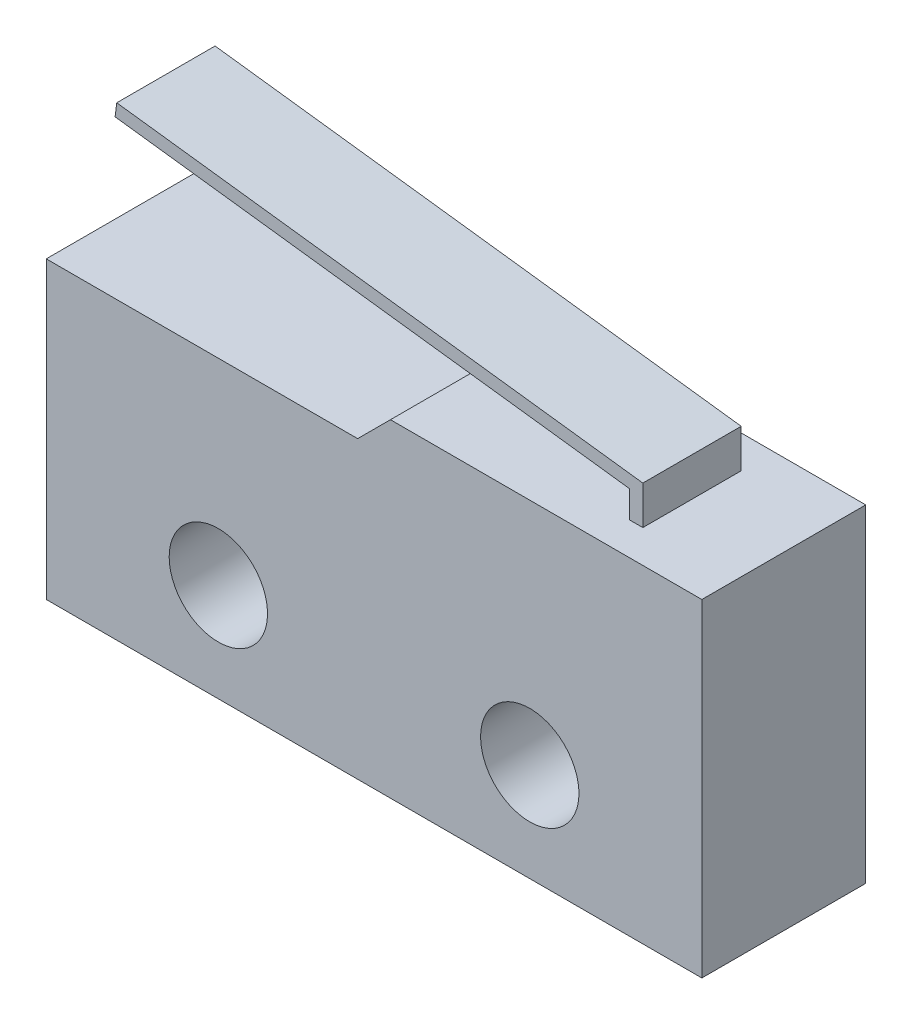
ISO-10303-21;
HEADER;
FILE_DESCRIPTION(('STEP AP214'),'2;1');
FILE_NAME('part.step','',(''),(''),'','','');
FILE_SCHEMA(('AUTOMOTIVE_DESIGN { 1 0 10303 214 1 1 1 1 }'));
ENDSEC;
DATA;
#1=APPLICATION_CONTEXT('core data for automotive mechanical design processes');
#2=APPLICATION_PROTOCOL_DEFINITION('international standard','automotive_design',2000,#1);
#3=PRODUCT_CONTEXT('',#1,'mechanical');
#4=PRODUCT('Part','Part','',(#3));
#5=PRODUCT_RELATED_PRODUCT_CATEGORY('part','',(#4));
#6=PRODUCT_DEFINITION_FORMATION('','',#4);
#7=PRODUCT_DEFINITION_CONTEXT('part definition',#1,'design');
#8=PRODUCT_DEFINITION('design','',#6,#7);
#9=PRODUCT_DEFINITION_SHAPE('','',#8);
#10=(LENGTH_UNIT() NAMED_UNIT(*) SI_UNIT(.MILLI.,.METRE.));
#11=(NAMED_UNIT(*) PLANE_ANGLE_UNIT() SI_UNIT($,.RADIAN.));
#12=(NAMED_UNIT(*) SI_UNIT($,.STERADIAN.) SOLID_ANGLE_UNIT());
#13=UNCERTAINTY_MEASURE_WITH_UNIT(LENGTH_MEASURE(1.E-05),#10,'distance_accuracy_value','');
#14=(GEOMETRIC_REPRESENTATION_CONTEXT(3) GLOBAL_UNCERTAINTY_ASSIGNED_CONTEXT((#13)) GLOBAL_UNIT_ASSIGNED_CONTEXT((#10,
#11,#12)) REPRESENTATION_CONTEXT('',''));
#15=CARTESIAN_POINT('',(0.,0.,0.));
#16=DIRECTION('',(0.,0.,1.));
#17=DIRECTION('',(1.,0.,0.));
#18=AXIS2_PLACEMENT_3D('',#15,#16,#17);
#19=CARTESIAN_POINT('',(10.,-5.,2.5));
#20=DIRECTION('',(-1.,0.,0.));
#21=DIRECTION('',(0.,0.,1.));
#22=AXIS2_PLACEMENT_3D('',#19,#20,#21);
#23=PLANE('',#22);
#24=DIRECTION('',(0.,1.,0.));
#25=VECTOR('',#24,1.);
#26=CARTESIAN_POINT('',(10.,-5.,-2.5));
#27=LINE('',#26,#25);
#28=CARTESIAN_POINT('',(10.,-5.,-2.5));
#29=VERTEX_POINT('',#28);
#30=CARTESIAN_POINT('',(10.,5.,-2.5));
#31=VERTEX_POINT('',#30);
#32=EDGE_CURVE('E181',#29,#31,#27,.T.);
#33=ORIENTED_EDGE('',*,*,#32,.T.);
#34=DIRECTION('',(0.,0.,-1.));
#35=VECTOR('',#34,1.);
#36=CARTESIAN_POINT('',(10.,5.,2.5));
#37=LINE('',#36,#35);
#38=CARTESIAN_POINT('',(10.,5.,2.5));
#39=VERTEX_POINT('',#38);
#40=EDGE_CURVE('E11',#39,#31,#37,.T.);
#41=ORIENTED_EDGE('',*,*,#40,.F.);
#42=DIRECTION('',(0.,1.,0.));
#43=VECTOR('',#42,1.);
#44=CARTESIAN_POINT('',(10.,-5.,2.5));
#45=LINE('',#44,#43);
#46=CARTESIAN_POINT('',(10.,-5.,2.5));
#47=VERTEX_POINT('',#46);
#48=EDGE_CURVE('E182',#47,#39,#45,.T.);
#49=ORIENTED_EDGE('',*,*,#48,.F.);
#50=DIRECTION('',(0.,0.,-1.));
#51=VECTOR('',#50,1.);
#52=CARTESIAN_POINT('',(10.,-5.,2.5));
#53=LINE('',#52,#51);
#54=EDGE_CURVE('E196',#47,#29,#53,.T.);
#55=ORIENTED_EDGE('',*,*,#54,.T.);
#56=EDGE_LOOP('',(#33,#41,#49,#55));
#57=FACE_BOUND('',#56,.T.);
#58=ADVANCED_FACE('F33',(#57),#23,.F.);
#59=CARTESIAN_POINT('',(0.5,5.,2.5));
#60=DIRECTION('',(0.,-1.,0.));
#61=DIRECTION('',(0.,0.,-1.));
#62=AXIS2_PLACEMENT_3D('',#59,#60,#61);
#63=PLANE('',#62);
#64=DIRECTION('',(0.,0.,-1.));
#65=VECTOR('',#64,1.);
#66=CARTESIAN_POINT('',(7.2,5.,1.5));
#67=LINE('',#66,#65);
#68=CARTESIAN_POINT('',(7.2,5.,1.5));
#69=VERTEX_POINT('',#68);
#70=CARTESIAN_POINT('',(7.2,5.,-1.5));
#71=VERTEX_POINT('',#70);
#72=EDGE_CURVE('E47',#69,#71,#67,.T.);
#73=ORIENTED_EDGE('',*,*,#72,.F.);
#74=DIRECTION('',(1.,0.,0.));
#75=VECTOR('',#74,1.);
#76=CARTESIAN_POINT('',(6.8,5.,1.5));
#77=LINE('',#76,#75);
#78=CARTESIAN_POINT('',(6.8,5.,1.5));
#79=VERTEX_POINT('',#78);
#80=EDGE_CURVE('E52',#79,#69,#77,.T.);
#81=ORIENTED_EDGE('',*,*,#80,.F.);
#82=DIRECTION('',(0.,0.,-1.));
#83=VECTOR('',#82,1.);
#84=CARTESIAN_POINT('',(6.8,5.,1.5));
#85=LINE('',#84,#83);
#86=CARTESIAN_POINT('',(6.8,5.,-1.5));
#87=VERTEX_POINT('',#86);
#88=EDGE_CURVE('E147',#79,#87,#85,.T.);
#89=ORIENTED_EDGE('',*,*,#88,.T.);
#90=DIRECTION('',(1.,0.,0.));
#91=VECTOR('',#90,1.);
#92=CARTESIAN_POINT('',(6.8,5.,-1.5));
#93=LINE('',#92,#91);
#94=EDGE_CURVE('E148',#87,#71,#93,.T.);
#95=ORIENTED_EDGE('',*,*,#94,.T.);
#96=EDGE_LOOP('',(#73,#81,#89,#95));
#97=FACE_BOUND('',#96,.T.);
#98=DIRECTION('',(-1.,0.,0.));
#99=VECTOR('',#98,1.);
#100=CARTESIAN_POINT('',(0.5,5.,-2.5));
#101=LINE('',#100,#99);
#102=CARTESIAN_POINT('',(0.5,5.,-2.5));
#103=VERTEX_POINT('',#102);
#104=EDGE_CURVE('E199',#31,#103,#101,.T.);
#105=ORIENTED_EDGE('',*,*,#104,.T.);
#106=DIRECTION('',(0.,0.,-1.));
#107=VECTOR('',#106,1.);
#108=CARTESIAN_POINT('',(0.5,5.,2.5));
#109=LINE('',#108,#107);
#110=CARTESIAN_POINT('',(0.5,5.,2.5));
#111=VERTEX_POINT('',#110);
#112=EDGE_CURVE('E40',#111,#103,#109,.T.);
#113=ORIENTED_EDGE('',*,*,#112,.F.);
#114=DIRECTION('',(-1.,0.,0.));
#115=VECTOR('',#114,1.);
#116=CARTESIAN_POINT('',(0.5,5.,2.5));
#117=LINE('',#116,#115);
#118=EDGE_CURVE('E185',#39,#111,#117,.T.);
#119=ORIENTED_EDGE('',*,*,#118,.F.);
#120=ORIENTED_EDGE('',*,*,#40,.T.);
#121=EDGE_LOOP('',(#105,#113,#119,#120));
#122=FACE_BOUND('',#121,.T.);
#123=ADVANCED_FACE('F246',(#97,#122),#63,.F.);
#124=CARTESIAN_POINT('',(-0.5,4.,2.5));
#125=DIRECTION('',(0.707106781186548,-0.707106781186548,0.));
#126=DIRECTION('',(0.707106781186548,0.707106781186548,0.));
#127=AXIS2_PLACEMENT_3D('',#124,#125,#126);
#128=PLANE('',#127);
#129=DIRECTION('',(-0.707106781186548,-0.707106781186548,0.));
#130=VECTOR('',#129,1.);
#131=CARTESIAN_POINT('',(-0.5,4.,-2.5));
#132=LINE('',#131,#130);
#133=CARTESIAN_POINT('',(-0.5,4.,-2.5));
#134=VERTEX_POINT('',#133);
#135=EDGE_CURVE('E201',#103,#134,#132,.T.);
#136=ORIENTED_EDGE('',*,*,#135,.T.);
#137=DIRECTION('',(0.,0.,-1.));
#138=VECTOR('',#137,1.);
#139=CARTESIAN_POINT('',(-0.5,4.,2.5));
#140=LINE('',#139,#138);
#141=CARTESIAN_POINT('',(-0.5,4.,2.5));
#142=VERTEX_POINT('',#141);
#143=EDGE_CURVE('E216',#142,#134,#140,.T.);
#144=ORIENTED_EDGE('',*,*,#143,.F.);
#145=DIRECTION('',(-0.707106781186548,-0.707106781186548,0.));
#146=VECTOR('',#145,1.);
#147=CARTESIAN_POINT('',(-0.5,4.,2.5));
#148=LINE('',#147,#146);
#149=EDGE_CURVE('E188',#111,#142,#148,.T.);
#150=ORIENTED_EDGE('',*,*,#149,.F.);
#151=ORIENTED_EDGE('',*,*,#112,.T.);
#152=EDGE_LOOP('',(#136,#144,#150,#151));
#153=FACE_BOUND('',#152,.T.);
#154=ADVANCED_FACE('F223',(#153),#128,.F.);
#155=CARTESIAN_POINT('',(-10.,4.,2.5));
#156=DIRECTION('',(0.,-1.,0.));
#157=DIRECTION('',(0.,0.,-1.));
#158=AXIS2_PLACEMENT_3D('',#155,#156,#157);
#159=PLANE('',#158);
#160=DIRECTION('',(-1.,0.,0.));
#161=VECTOR('',#160,1.);
#162=CARTESIAN_POINT('',(-10.,4.,-2.5));
#163=LINE('',#162,#161);
#164=CARTESIAN_POINT('',(-10.,4.,-2.5));
#165=VERTEX_POINT('',#164);
#166=EDGE_CURVE('E203',#134,#165,#163,.T.);
#167=ORIENTED_EDGE('',*,*,#166,.T.);
#168=DIRECTION('',(0.,0.,-1.));
#169=VECTOR('',#168,1.);
#170=CARTESIAN_POINT('',(-10.,4.,2.5));
#171=LINE('',#170,#169);
#172=CARTESIAN_POINT('',(-10.,4.,2.5));
#173=VERTEX_POINT('',#172);
#174=EDGE_CURVE('E213',#173,#165,#171,.T.);
#175=ORIENTED_EDGE('',*,*,#174,.F.);
#176=DIRECTION('',(-1.,0.,0.));
#177=VECTOR('',#176,1.);
#178=CARTESIAN_POINT('',(-10.,4.,2.5));
#179=LINE('',#178,#177);
#180=EDGE_CURVE('E190',#142,#173,#179,.T.);
#181=ORIENTED_EDGE('',*,*,#180,.F.);
#182=ORIENTED_EDGE('',*,*,#143,.T.);
#183=EDGE_LOOP('',(#167,#175,#181,#182));
#184=FACE_BOUND('',#183,.T.);
#185=ADVANCED_FACE('F234',(#184),#159,.F.);
#186=CARTESIAN_POINT('',(-10.,-5.,2.5));
#187=DIRECTION('',(1.,0.,0.));
#188=DIRECTION('',(0.,0.,-1.));
#189=AXIS2_PLACEMENT_3D('',#186,#187,#188);
#190=PLANE('',#189);
#191=DIRECTION('',(0.,-1.,0.));
#192=VECTOR('',#191,1.);
#193=CARTESIAN_POINT('',(-10.,-5.,-2.5));
#194=LINE('',#193,#192);
#195=CARTESIAN_POINT('',(-10.,-5.,-2.5));
#196=VERTEX_POINT('',#195);
#197=EDGE_CURVE('E205',#165,#196,#194,.T.);
#198=ORIENTED_EDGE('',*,*,#197,.T.);
#199=DIRECTION('',(0.,0.,-1.));
#200=VECTOR('',#199,1.);
#201=CARTESIAN_POINT('',(-10.,-5.,2.5));
#202=LINE('',#201,#200);
#203=CARTESIAN_POINT('',(-10.,-5.,2.5));
#204=VERTEX_POINT('',#203);
#205=EDGE_CURVE('E210',#204,#196,#202,.T.);
#206=ORIENTED_EDGE('',*,*,#205,.F.);
#207=DIRECTION('',(0.,-1.,0.));
#208=VECTOR('',#207,1.);
#209=CARTESIAN_POINT('',(-10.,-5.,2.5));
#210=LINE('',#209,#208);
#211=EDGE_CURVE('E192',#173,#204,#210,.T.);
#212=ORIENTED_EDGE('',*,*,#211,.F.);
#213=ORIENTED_EDGE('',*,*,#174,.T.);
#214=EDGE_LOOP('',(#198,#206,#212,#213));
#215=FACE_BOUND('',#214,.T.);
#216=ADVANCED_FACE('F238',(#215),#190,.F.);
#217=CARTESIAN_POINT('',(-10.,-5.,2.5));
#218=DIRECTION('',(0.,1.,0.));
#219=DIRECTION('',(0.,0.,1.));
#220=AXIS2_PLACEMENT_3D('',#217,#218,#219);
#221=PLANE('',#220);
#222=DIRECTION('',(1.,0.,0.));
#223=VECTOR('',#222,1.);
#224=CARTESIAN_POINT('',(-10.,-5.,-2.5));
#225=LINE('',#224,#223);
#226=EDGE_CURVE('E186',#196,#29,#225,.T.);
#227=ORIENTED_EDGE('',*,*,#226,.T.);
#228=ORIENTED_EDGE('',*,*,#54,.F.);
#229=DIRECTION('',(1.,0.,0.));
#230=VECTOR('',#229,1.);
#231=CARTESIAN_POINT('',(-10.,-5.,2.5));
#232=LINE('',#231,#230);
#233=EDGE_CURVE('E194',#204,#47,#232,.T.);
#234=ORIENTED_EDGE('',*,*,#233,.F.);
#235=ORIENTED_EDGE('',*,*,#205,.T.);
#236=EDGE_LOOP('',(#227,#228,#234,#235));
#237=FACE_BOUND('',#236,.T.);
#238=ADVANCED_FACE('F249',(#237),#221,.F.);
#239=CARTESIAN_POINT('',(10.,5.,2.5));
#240=DIRECTION('',(0.,0.,-1.));
#241=DIRECTION('',(-1.,0.,0.));
#242=AXIS2_PLACEMENT_3D('',#239,#240,#241);
#243=PLANE('',#242);
#244=CARTESIAN_POINT('',(4.75,-2.,2.5));
#245=DIRECTION('',(0.,0.,-1.));
#246=DIRECTION('',(-1.,0.,0.));
#247=AXIS2_PLACEMENT_3D('',#244,#245,#246);
#248=CIRCLE('',#247,1.49999999999999);
#249=CARTESIAN_POINT('',(3.25000000000001,-2.,2.5));
#250=VERTEX_POINT('',#249);
#251=EDGE_CURVE('E172',#250,#250,#248,.T.);
#252=ORIENTED_EDGE('',*,*,#251,.T.);
#253=EDGE_LOOP('',(#252));
#254=FACE_BOUND('',#253,.T.);
#255=CARTESIAN_POINT('',(-4.75,-2.,2.5));
#256=DIRECTION('',(0.,0.,-1.));
#257=DIRECTION('',(-1.,0.,0.));
#258=AXIS2_PLACEMENT_3D('',#255,#256,#257);
#259=CIRCLE('',#258,1.49999999999999);
#260=CARTESIAN_POINT('',(-6.24999999999999,-2.,2.5));
#261=VERTEX_POINT('',#260);
#262=EDGE_CURVE('E178',#261,#261,#259,.T.);
#263=ORIENTED_EDGE('',*,*,#262,.T.);
#264=EDGE_LOOP('',(#263));
#265=FACE_BOUND('',#264,.T.);
#266=ORIENTED_EDGE('',*,*,#48,.T.);
#267=ORIENTED_EDGE('',*,*,#118,.T.);
#268=ORIENTED_EDGE('',*,*,#149,.T.);
#269=ORIENTED_EDGE('',*,*,#180,.T.);
#270=ORIENTED_EDGE('',*,*,#211,.T.);
#271=ORIENTED_EDGE('',*,*,#233,.T.);
#272=EDGE_LOOP('',(#266,#267,#268,#269,#270,#271));
#273=FACE_BOUND('',#272,.T.);
#274=ADVANCED_FACE('F242',(#254,#265,#273),#243,.F.);
#275=CARTESIAN_POINT('',(10.,5.,-2.5));
#276=DIRECTION('',(0.,0.,-1.));
#277=DIRECTION('',(-1.,0.,0.));
#278=AXIS2_PLACEMENT_3D('',#275,#276,#277);
#279=PLANE('',#278);
#280=CARTESIAN_POINT('',(4.75,-2.,-2.5));
#281=DIRECTION('',(0.,0.,-1.));
#282=DIRECTION('',(-1.,0.,0.));
#283=AXIS2_PLACEMENT_3D('',#280,#281,#282);
#284=CIRCLE('',#283,1.49999999999999);
#285=CARTESIAN_POINT('',(3.25000000000001,-2.,-2.5));
#286=VERTEX_POINT('',#285);
#287=EDGE_CURVE('E169',#286,#286,#284,.T.);
#288=ORIENTED_EDGE('',*,*,#287,.F.);
#289=EDGE_LOOP('',(#288));
#290=FACE_BOUND('',#289,.T.);
#291=CARTESIAN_POINT('',(-4.75,-2.,-2.5));
#292=DIRECTION('',(0.,0.,-1.));
#293=DIRECTION('',(-1.,0.,0.));
#294=AXIS2_PLACEMENT_3D('',#291,#292,#293);
#295=CIRCLE('',#294,1.49999999999999);
#296=CARTESIAN_POINT('',(-6.24999999999999,-2.,-2.5));
#297=VERTEX_POINT('',#296);
#298=EDGE_CURVE('E175',#297,#297,#295,.T.);
#299=ORIENTED_EDGE('',*,*,#298,.F.);
#300=EDGE_LOOP('',(#299));
#301=FACE_BOUND('',#300,.T.);
#302=ORIENTED_EDGE('',*,*,#32,.F.);
#303=ORIENTED_EDGE('',*,*,#226,.F.);
#304=ORIENTED_EDGE('',*,*,#197,.F.);
#305=ORIENTED_EDGE('',*,*,#166,.F.);
#306=ORIENTED_EDGE('',*,*,#135,.F.);
#307=ORIENTED_EDGE('',*,*,#104,.F.);
#308=EDGE_LOOP('',(#302,#303,#304,#305,#306,#307));
#309=FACE_BOUND('',#308,.T.);
#310=ADVANCED_FACE('F229',(#290,#301,#309),#279,.T.);
#311=CARTESIAN_POINT('',(-4.75,-2.,-2.5));
#312=DIRECTION('',(0.,0.,-1.));
#313=DIRECTION('',(-1.,0.,0.));
#314=AXIS2_PLACEMENT_3D('',#311,#312,#313);
#315=CYLINDRICAL_SURFACE('',#314,1.49999999999999);
#316=ORIENTED_EDGE('',*,*,#262,.F.);
#317=EDGE_LOOP('',(#316));
#318=FACE_BOUND('',#317,.T.);
#319=ORIENTED_EDGE('',*,*,#298,.T.);
#320=EDGE_LOOP('',(#319));
#321=FACE_BOUND('',#320,.T.);
#322=ADVANCED_FACE('F297',(#318,#321),#315,.F.);
#323=CARTESIAN_POINT('',(4.75,-2.,-2.5));
#324=DIRECTION('',(0.,0.,-1.));
#325=DIRECTION('',(-1.,0.,0.));
#326=AXIS2_PLACEMENT_3D('',#323,#324,#325);
#327=CYLINDRICAL_SURFACE('',#326,1.49999999999999);
#328=ORIENTED_EDGE('',*,*,#251,.F.);
#329=EDGE_LOOP('',(#328));
#330=FACE_BOUND('',#329,.T.);
#331=ORIENTED_EDGE('',*,*,#287,.T.);
#332=EDGE_LOOP('',(#331));
#333=FACE_BOUND('',#332,.T.);
#334=ADVANCED_FACE('F306',(#330,#333),#327,.F.);
#335=CARTESIAN_POINT('',(7.2,5.,1.5));
#336=DIRECTION('',(-1.,0.,0.));
#337=DIRECTION('',(0.,0.,1.));
#338=AXIS2_PLACEMENT_3D('',#335,#336,#337);
#339=PLANE('',#338);
#340=DIRECTION('',(0.,1.,0.));
#341=VECTOR('',#340,1.);
#342=CARTESIAN_POINT('',(7.2,5.,-1.5));
#343=LINE('',#342,#341);
#344=CARTESIAN_POINT('',(7.2,6.17638342073764,-1.5));
#345=VERTEX_POINT('',#344);
#346=EDGE_CURVE('E130',#71,#345,#343,.T.);
#347=ORIENTED_EDGE('',*,*,#346,.T.);
#348=DIRECTION('',(0.,0.,-1.));
#349=VECTOR('',#348,1.);
#350=CARTESIAN_POINT('',(7.2,6.17638342073764,1.5));
#351=LINE('',#350,#349);
#352=CARTESIAN_POINT('',(7.2,6.17638342073764,1.5));
#353=VERTEX_POINT('',#352);
#354=EDGE_CURVE('E127',#353,#345,#351,.T.);
#355=ORIENTED_EDGE('',*,*,#354,.F.);
#356=DIRECTION('',(0.,1.,0.));
#357=VECTOR('',#356,1.);
#358=CARTESIAN_POINT('',(7.2,5.,1.5));
#359=LINE('',#358,#357);
#360=EDGE_CURVE('E118',#69,#353,#359,.T.);
#361=ORIENTED_EDGE('',*,*,#360,.F.);
#362=ORIENTED_EDGE('',*,*,#72,.T.);
#363=EDGE_LOOP('',(#347,#355,#361,#362));
#364=FACE_BOUND('',#363,.T.);
#365=ADVANCED_FACE('F128',(#364),#339,.F.);
#366=CARTESIAN_POINT('',(7.2,6.17638342073764,1.5));
#367=DIRECTION('',(-0.125,-0.992156741649221,0.));
#368=DIRECTION('',(0.992156741649222,-0.125,0.));
#369=AXIS2_PLACEMENT_3D('',#366,#367,#368);
#370=PLANE('',#369);
#371=DIRECTION('',(-0.992156741649221,0.125,0.));
#372=VECTOR('',#371,1.);
#373=CARTESIAN_POINT('',(7.2,6.17638342073764,-1.5));
#374=LINE('',#373,#372);
#375=CARTESIAN_POINT('',(-8.84950786638754,8.19843134832984,-1.5));
#376=VERTEX_POINT('',#375);
#377=EDGE_CURVE('E151',#345,#376,#374,.T.);
#378=ORIENTED_EDGE('',*,*,#377,.T.);
#379=DIRECTION('',(0.,0.,-1.));
#380=VECTOR('',#379,1.);
#381=CARTESIAN_POINT('',(-8.84950786638754,8.19843134832984,1.5));
#382=LINE('',#381,#380);
#383=CARTESIAN_POINT('',(-8.84950786638754,8.19843134832984,1.5));
#384=VERTEX_POINT('',#383);
#385=EDGE_CURVE('E133',#384,#376,#382,.T.);
#386=ORIENTED_EDGE('',*,*,#385,.F.);
#387=DIRECTION('',(-0.992156741649221,0.125,0.));
#388=VECTOR('',#387,1.);
#389=CARTESIAN_POINT('',(7.2,6.17638342073764,1.5));
#390=LINE('',#389,#388);
#391=EDGE_CURVE('E122',#353,#384,#390,.T.);
#392=ORIENTED_EDGE('',*,*,#391,.F.);
#393=ORIENTED_EDGE('',*,*,#354,.T.);
#394=EDGE_LOOP('',(#378,#386,#392,#393));
#395=FACE_BOUND('',#394,.T.);
#396=ADVANCED_FACE('F135',(#395),#370,.F.);
#397=CARTESIAN_POINT('',(-8.84950786638754,8.19843134832984,1.5));
#398=DIRECTION('',(0.992156741649221,-0.125000000000003,0.));
#399=DIRECTION('',(0.125000000000004,0.992156741649221,0.));
#400=AXIS2_PLACEMENT_3D('',#397,#398,#399);
#401=PLANE('',#400);
#402=DIRECTION('',(-0.125000000000003,-0.992156741649221,0.));
#403=VECTOR('',#402,1.);
#404=CARTESIAN_POINT('',(-8.84950786638754,8.19843134832984,-1.5));
#405=LINE('',#404,#403);
#406=CARTESIAN_POINT('',(-8.89950786638754,7.80156865167016,-1.5));
#407=VERTEX_POINT('',#406);
#408=EDGE_CURVE('E153',#376,#407,#405,.T.);
#409=ORIENTED_EDGE('',*,*,#408,.T.);
#410=DIRECTION('',(0.,0.,-1.));
#411=VECTOR('',#410,1.);
#412=CARTESIAN_POINT('',(-8.89950786638754,7.80156865167016,1.5));
#413=LINE('',#412,#411);
#414=CARTESIAN_POINT('',(-8.89950786638754,7.80156865167016,1.5));
#415=VERTEX_POINT('',#414);
#416=EDGE_CURVE('E164',#415,#407,#413,.T.);
#417=ORIENTED_EDGE('',*,*,#416,.F.);
#418=DIRECTION('',(-0.125000000000003,-0.992156741649221,0.));
#419=VECTOR('',#418,1.);
#420=CARTESIAN_POINT('',(-8.84950786638754,8.19843134832984,1.5));
#421=LINE('',#420,#419);
#422=EDGE_CURVE('E138',#384,#415,#421,.T.);
#423=ORIENTED_EDGE('',*,*,#422,.F.);
#424=ORIENTED_EDGE('',*,*,#385,.T.);
#425=EDGE_LOOP('',(#409,#417,#423,#424));
#426=FACE_BOUND('',#425,.T.);
#427=ADVANCED_FACE('F339',(#426),#401,.F.);
#428=CARTESIAN_POINT('',(6.8,5.82361657926236,1.5));
#429=DIRECTION('',(0.125,0.992156741649221,0.));
#430=DIRECTION('',(-0.992156741649222,0.125,0.));
#431=AXIS2_PLACEMENT_3D('',#428,#429,#430);
#432=PLANE('',#431);
#433=DIRECTION('',(0.992156741649222,-0.125,0.));
#434=VECTOR('',#433,1.);
#435=CARTESIAN_POINT('',(6.8,5.82361657926236,-1.5));
#436=LINE('',#435,#434);
#437=CARTESIAN_POINT('',(6.8,5.82361657926236,-1.5));
#438=VERTEX_POINT('',#437);
#439=EDGE_CURVE('E155',#407,#438,#436,.T.);
#440=ORIENTED_EDGE('',*,*,#439,.T.);
#441=DIRECTION('',(0.,0.,-1.));
#442=VECTOR('',#441,1.);
#443=CARTESIAN_POINT('',(6.8,5.82361657926236,1.5));
#444=LINE('',#443,#442);
#445=CARTESIAN_POINT('',(6.8,5.82361657926236,1.5));
#446=VERTEX_POINT('',#445);
#447=EDGE_CURVE('E161',#446,#438,#444,.T.);
#448=ORIENTED_EDGE('',*,*,#447,.F.);
#449=DIRECTION('',(0.992156741649222,-0.125,0.));
#450=VECTOR('',#449,1.);
#451=CARTESIAN_POINT('',(6.8,5.82361657926236,1.5));
#452=LINE('',#451,#450);
#453=EDGE_CURVE('E140',#415,#446,#452,.T.);
#454=ORIENTED_EDGE('',*,*,#453,.F.);
#455=ORIENTED_EDGE('',*,*,#416,.T.);
#456=EDGE_LOOP('',(#440,#448,#454,#455));
#457=FACE_BOUND('',#456,.T.);
#458=ADVANCED_FACE('F348',(#457),#432,.F.);
#459=CARTESIAN_POINT('',(6.8,5.,1.5));
#460=DIRECTION('',(1.,0.,0.));
#461=DIRECTION('',(0.,0.,-1.));
#462=AXIS2_PLACEMENT_3D('',#459,#460,#461);
#463=PLANE('',#462);
#464=DIRECTION('',(0.,-1.,0.));
#465=VECTOR('',#464,1.);
#466=CARTESIAN_POINT('',(6.8,5.,-1.5));
#467=LINE('',#466,#465);
#468=EDGE_CURVE('E157',#438,#87,#467,.T.);
#469=ORIENTED_EDGE('',*,*,#468,.T.);
#470=ORIENTED_EDGE('',*,*,#88,.F.);
#471=DIRECTION('',(0.,-1.,0.));
#472=VECTOR('',#471,1.);
#473=CARTESIAN_POINT('',(6.8,5.,1.5));
#474=LINE('',#473,#472);
#475=EDGE_CURVE('E145',#446,#79,#474,.T.);
#476=ORIENTED_EDGE('',*,*,#475,.F.);
#477=ORIENTED_EDGE('',*,*,#447,.T.);
#478=EDGE_LOOP('',(#469,#470,#476,#477));
#479=FACE_BOUND('',#478,.T.);
#480=ADVANCED_FACE('F358',(#479),#463,.F.);
#481=CARTESIAN_POINT('',(7.2,5.,1.5));
#482=DIRECTION('',(0.,0.,1.));
#483=DIRECTION('',(1.,0.,0.));
#484=AXIS2_PLACEMENT_3D('',#481,#482,#483);
#485=PLANE('',#484);
#486=ORIENTED_EDGE('',*,*,#80,.T.);
#487=ORIENTED_EDGE('',*,*,#360,.T.);
#488=ORIENTED_EDGE('',*,*,#391,.T.);
#489=ORIENTED_EDGE('',*,*,#422,.T.);
#490=ORIENTED_EDGE('',*,*,#453,.T.);
#491=ORIENTED_EDGE('',*,*,#475,.T.);
#492=EDGE_LOOP('',(#486,#487,#488,#489,#490,#491));
#493=FACE_BOUND('',#492,.T.);
#494=ADVANCED_FACE('F120',(#493),#485,.T.);
#495=CARTESIAN_POINT('',(7.2,5.,-1.5));
#496=DIRECTION('',(0.,0.,1.));
#497=DIRECTION('',(1.,0.,0.));
#498=AXIS2_PLACEMENT_3D('',#495,#496,#497);
#499=PLANE('',#498);
#500=ORIENTED_EDGE('',*,*,#94,.F.);
#501=ORIENTED_EDGE('',*,*,#468,.F.);
#502=ORIENTED_EDGE('',*,*,#439,.F.);
#503=ORIENTED_EDGE('',*,*,#408,.F.);
#504=ORIENTED_EDGE('',*,*,#377,.F.);
#505=ORIENTED_EDGE('',*,*,#346,.F.);
#506=EDGE_LOOP('',(#500,#501,#502,#503,#504,#505));
#507=FACE_BOUND('',#506,.T.);
#508=ADVANCED_FACE('F377',(#507),#499,.F.);
#509=CLOSED_SHELL('',(#58,#123,#154,#185,#216,#238,#274,#310,#322,#334,#365,#396,#427,#458,#480,
#494,#508));
#510=MANIFOLD_SOLID_BREP('B2',#509);
#511=ADVANCED_BREP_SHAPE_REPRESENTATION('',(#18,#510),#14);
#512=SHAPE_DEFINITION_REPRESENTATION(#9,#511);
ENDSEC;
END-ISO-10303-21;
